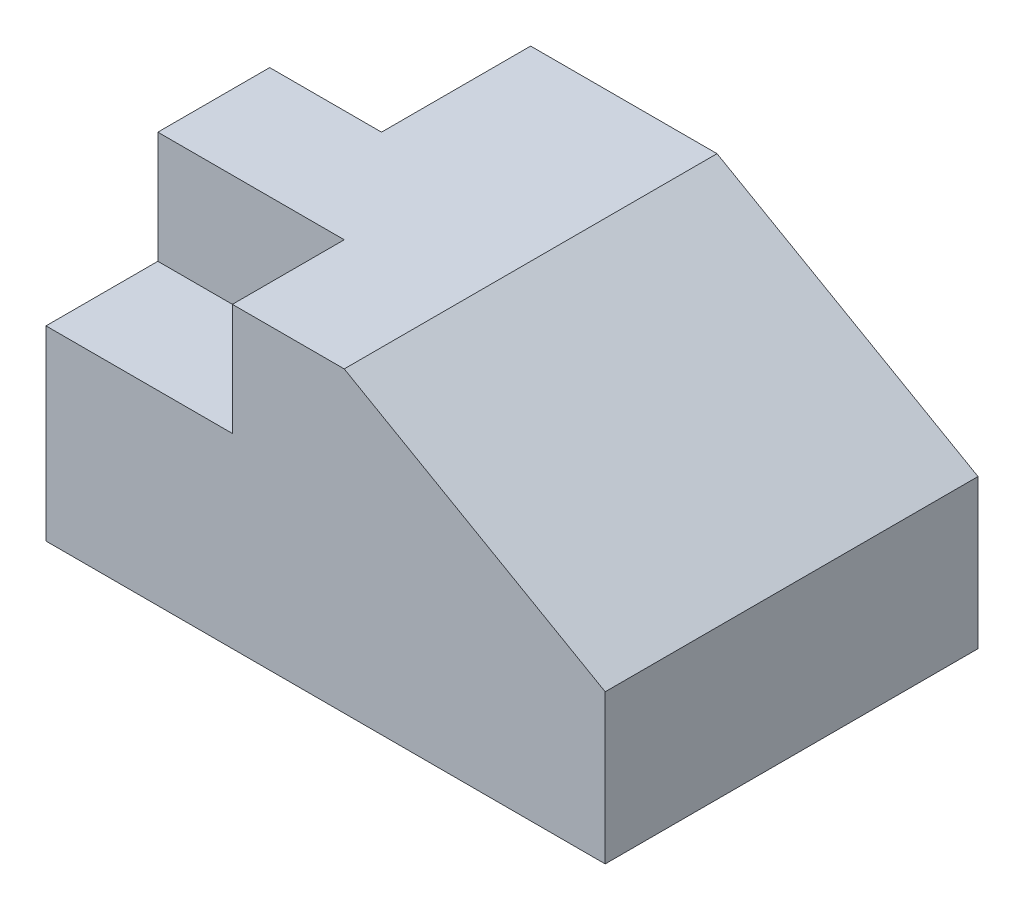
ISO-10303-21;
HEADER;
FILE_DESCRIPTION(('STEP AP214'),'2;1');
FILE_NAME('part.step','',(''),(''),'','','');
FILE_SCHEMA(('AUTOMOTIVE_DESIGN { 1 0 10303 214 1 1 1 1 }'));
ENDSEC;
DATA;
#1=APPLICATION_CONTEXT('core data for automotive mechanical design processes');
#2=APPLICATION_PROTOCOL_DEFINITION('international standard','automotive_design',2000,#1);
#3=PRODUCT_CONTEXT('',#1,'mechanical');
#4=PRODUCT('Part','Part','',(#3));
#5=PRODUCT_RELATED_PRODUCT_CATEGORY('part','',(#4));
#6=PRODUCT_DEFINITION_FORMATION('','',#4);
#7=PRODUCT_DEFINITION_CONTEXT('part definition',#1,'design');
#8=PRODUCT_DEFINITION('design','',#6,#7);
#9=PRODUCT_DEFINITION_SHAPE('','',#8);
#10=(LENGTH_UNIT() NAMED_UNIT(*) SI_UNIT(.MILLI.,.METRE.));
#11=(NAMED_UNIT(*) PLANE_ANGLE_UNIT() SI_UNIT($,.RADIAN.));
#12=(NAMED_UNIT(*) SI_UNIT($,.STERADIAN.) SOLID_ANGLE_UNIT());
#13=UNCERTAINTY_MEASURE_WITH_UNIT(LENGTH_MEASURE(1.E-05),#10,'distance_accuracy_value','');
#14=(GEOMETRIC_REPRESENTATION_CONTEXT(3) GLOBAL_UNCERTAINTY_ASSIGNED_CONTEXT((#13)) GLOBAL_UNIT_ASSIGNED_CONTEXT((#10,
#11,#12)) REPRESENTATION_CONTEXT('',''));
#15=CARTESIAN_POINT('',(0.,0.,0.));
#16=DIRECTION('',(0.,0.,1.));
#17=DIRECTION('',(1.,0.,0.));
#18=AXIS2_PLACEMENT_3D('',#15,#16,#17);
#19=CARTESIAN_POINT('',(0.,0.,50.));
#20=DIRECTION('',(-1.,0.,0.));
#21=DIRECTION('',(0.,0.,1.));
#22=AXIS2_PLACEMENT_3D('',#19,#20,#21);
#23=PLANE('',#22);
#24=DIRECTION('',(0.,1.,0.));
#25=VECTOR('',#24,1.);
#26=CARTESIAN_POINT('',(0.,50.,-10.));
#27=LINE('',#26,#25);
#28=CARTESIAN_POINT('',(0.,50.,-10.));
#29=VERTEX_POINT('',#28);
#30=CARTESIAN_POINT('',(0.,80.,-10.));
#31=VERTEX_POINT('',#30);
#32=EDGE_CURVE('E128',#29,#31,#27,.T.);
#33=ORIENTED_EDGE('',*,*,#32,.F.);
#34=DIRECTION('',(0.,0.,1.));
#35=VECTOR('',#34,1.);
#36=CARTESIAN_POINT('',(0.,50.,-50.));
#37=LINE('',#36,#35);
#38=CARTESIAN_POINT('',(0.,50.,-50.));
#39=VERTEX_POINT('',#38);
#40=EDGE_CURVE('E131',#39,#29,#37,.T.);
#41=ORIENTED_EDGE('',*,*,#40,.F.);
#42=DIRECTION('',(0.,1.,0.));
#43=VECTOR('',#42,1.);
#44=CARTESIAN_POINT('',(0.,0.,-50.));
#45=LINE('',#44,#43);
#46=CARTESIAN_POINT('',(0.,0.,-50.));
#47=VERTEX_POINT('',#46);
#48=EDGE_CURVE('E187',#47,#39,#45,.T.);
#49=ORIENTED_EDGE('',*,*,#48,.F.);
#50=DIRECTION('',(0.,0.,-1.));
#51=VECTOR('',#50,1.);
#52=CARTESIAN_POINT('',(0.,0.,50.));
#53=LINE('',#52,#51);
#54=CARTESIAN_POINT('',(0.,0.,50.));
#55=VERTEX_POINT('',#54);
#56=EDGE_CURVE('E11',#55,#47,#53,.T.);
#57=ORIENTED_EDGE('',*,*,#56,.F.);
#58=DIRECTION('',(0.,1.,0.));
#59=VECTOR('',#58,1.);
#60=CARTESIAN_POINT('',(0.,0.,50.));
#61=LINE('',#60,#59);
#62=CARTESIAN_POINT('',(0.,50.,50.));
#63=VERTEX_POINT('',#62);
#64=EDGE_CURVE('E172',#55,#63,#61,.T.);
#65=ORIENTED_EDGE('',*,*,#64,.T.);
#66=DIRECTION('',(0.,0.,1.));
#67=VECTOR('',#66,1.);
#68=CARTESIAN_POINT('',(0.,50.,50.));
#69=LINE('',#68,#67);
#70=CARTESIAN_POINT('',(0.,50.,20.));
#71=VERTEX_POINT('',#70);
#72=EDGE_CURVE('E55',#71,#63,#69,.T.);
#73=ORIENTED_EDGE('',*,*,#72,.F.);
#74=DIRECTION('',(0.,1.,0.));
#75=VECTOR('',#74,1.);
#76=CARTESIAN_POINT('',(0.,50.,20.));
#77=LINE('',#76,#75);
#78=CARTESIAN_POINT('',(0.,80.,20.));
#79=VERTEX_POINT('',#78);
#80=EDGE_CURVE('E157',#71,#79,#77,.T.);
#81=ORIENTED_EDGE('',*,*,#80,.T.);
#82=DIRECTION('',(0.,0.,-1.));
#83=VECTOR('',#82,1.);
#84=CARTESIAN_POINT('',(0.,80.,50.));
#85=LINE('',#84,#83);
#86=EDGE_CURVE('E145',#79,#31,#85,.T.);
#87=ORIENTED_EDGE('',*,*,#86,.T.);
#88=EDGE_LOOP('',(#33,#41,#49,#57,#65,#73,#81,#87));
#89=FACE_BOUND('',#88,.T.);
#90=ADVANCED_FACE('F41',(#89),#23,.T.);
#91=CARTESIAN_POINT('',(0.,0.,50.));
#92=DIRECTION('',(0.,-1.,0.));
#93=DIRECTION('',(0.,0.,-1.));
#94=AXIS2_PLACEMENT_3D('',#91,#92,#93);
#95=PLANE('',#94);
#96=DIRECTION('',(-1.,0.,0.));
#97=VECTOR('',#96,1.);
#98=CARTESIAN_POINT('',(0.,0.,-50.));
#99=LINE('',#98,#97);
#100=CARTESIAN_POINT('',(150.,0.,-50.));
#101=VERTEX_POINT('',#100);
#102=EDGE_CURVE('E189',#101,#47,#99,.T.);
#103=ORIENTED_EDGE('',*,*,#102,.F.);
#104=DIRECTION('',(0.,0.,-1.));
#105=VECTOR('',#104,1.);
#106=CARTESIAN_POINT('',(150.,0.,50.));
#107=LINE('',#106,#105);
#108=CARTESIAN_POINT('',(150.,0.,50.));
#109=VERTEX_POINT('',#108);
#110=EDGE_CURVE('E48',#109,#101,#107,.T.);
#111=ORIENTED_EDGE('',*,*,#110,.F.);
#112=DIRECTION('',(-1.,0.,0.));
#113=VECTOR('',#112,1.);
#114=CARTESIAN_POINT('',(0.,0.,50.));
#115=LINE('',#114,#113);
#116=EDGE_CURVE('E175',#109,#55,#115,.T.);
#117=ORIENTED_EDGE('',*,*,#116,.T.);
#118=ORIENTED_EDGE('',*,*,#56,.T.);
#119=EDGE_LOOP('',(#103,#111,#117,#118));
#120=FACE_BOUND('',#119,.T.);
#121=ADVANCED_FACE('F211',(#120),#95,.T.);
#122=CARTESIAN_POINT('',(150.,0.,50.));
#123=DIRECTION('',(1.,0.,0.));
#124=DIRECTION('',(0.,0.,-1.));
#125=AXIS2_PLACEMENT_3D('',#122,#123,#124);
#126=PLANE('',#125);
#127=DIRECTION('',(0.,-1.,0.));
#128=VECTOR('',#127,1.);
#129=CARTESIAN_POINT('',(150.,0.,-50.));
#130=LINE('',#129,#128);
#131=CARTESIAN_POINT('',(150.,40.,-50.));
#132=VERTEX_POINT('',#131);
#133=EDGE_CURVE('E192',#132,#101,#130,.T.);
#134=ORIENTED_EDGE('',*,*,#133,.F.);
#135=DIRECTION('',(0.,0.,-1.));
#136=VECTOR('',#135,1.);
#137=CARTESIAN_POINT('',(150.,40.,50.));
#138=LINE('',#137,#136);
#139=CARTESIAN_POINT('',(150.,40.,50.));
#140=VERTEX_POINT('',#139);
#141=EDGE_CURVE('E203',#140,#132,#138,.T.);
#142=ORIENTED_EDGE('',*,*,#141,.F.);
#143=DIRECTION('',(0.,-1.,0.));
#144=VECTOR('',#143,1.);
#145=CARTESIAN_POINT('',(150.,0.,50.));
#146=LINE('',#145,#144);
#147=EDGE_CURVE('E179',#140,#109,#146,.T.);
#148=ORIENTED_EDGE('',*,*,#147,.T.);
#149=ORIENTED_EDGE('',*,*,#110,.T.);
#150=EDGE_LOOP('',(#134,#142,#148,#149));
#151=FACE_BOUND('',#150,.T.);
#152=ADVANCED_FACE('F207',(#151),#126,.T.);
#153=CARTESIAN_POINT('',(54.1538461538461,94.7692307692307,50.));
#154=DIRECTION('',(0.496138938356834,0.868243142124459,0.));
#155=DIRECTION('',(-0.868243142124459,0.496138938356834,0.));
#156=AXIS2_PLACEMENT_3D('',#153,#154,#155);
#157=PLANE('',#156);
#158=DIRECTION('',(0.868243142124459,-0.496138938356834,0.));
#159=VECTOR('',#158,1.);
#160=CARTESIAN_POINT('',(54.1538461538461,94.7692307692307,-50.));
#161=LINE('',#160,#159);
#162=CARTESIAN_POINT('',(80.,80.,-50.));
#163=VERTEX_POINT('',#162);
#164=EDGE_CURVE('E195',#163,#132,#161,.T.);
#165=ORIENTED_EDGE('',*,*,#164,.F.);
#166=DIRECTION('',(0.,0.,-1.));
#167=VECTOR('',#166,1.);
#168=CARTESIAN_POINT('',(80.,80.,50.));
#169=LINE('',#168,#167);
#170=CARTESIAN_POINT('',(80.,80.,50.));
#171=VERTEX_POINT('',#170);
#172=EDGE_CURVE('E200',#171,#163,#169,.T.);
#173=ORIENTED_EDGE('',*,*,#172,.F.);
#174=DIRECTION('',(0.868243142124459,-0.496138938356834,0.));
#175=VECTOR('',#174,1.);
#176=CARTESIAN_POINT('',(54.1538461538461,94.7692307692307,50.));
#177=LINE('',#176,#175);
#178=EDGE_CURVE('E182',#171,#140,#177,.T.);
#179=ORIENTED_EDGE('',*,*,#178,.T.);
#180=ORIENTED_EDGE('',*,*,#141,.T.);
#181=EDGE_LOOP('',(#165,#173,#179,#180));
#182=FACE_BOUND('',#181,.T.);
#183=ADVANCED_FACE('F219',(#182),#157,.T.);
#184=CARTESIAN_POINT('',(0.,80.,50.));
#185=DIRECTION('',(0.,1.,0.));
#186=DIRECTION('',(0.,0.,1.));
#187=AXIS2_PLACEMENT_3D('',#184,#185,#186);
#188=PLANE('',#187);
#189=DIRECTION('',(0.,0.,-1.));
#190=VECTOR('',#189,1.);
#191=CARTESIAN_POINT('',(30.,80.,-50.));
#192=LINE('',#191,#190);
#193=CARTESIAN_POINT('',(30.,80.,-10.));
#194=VERTEX_POINT('',#193);
#195=CARTESIAN_POINT('',(30.,80.,-50.));
#196=VERTEX_POINT('',#195);
#197=EDGE_CURVE('E140',#194,#196,#192,.T.);
#198=ORIENTED_EDGE('',*,*,#197,.F.);
#199=DIRECTION('',(1.,0.,0.));
#200=VECTOR('',#199,1.);
#201=CARTESIAN_POINT('',(0.,80.,-10.));
#202=LINE('',#201,#200);
#203=EDGE_CURVE('E164',#31,#194,#202,.T.);
#204=ORIENTED_EDGE('',*,*,#203,.F.);
#205=ORIENTED_EDGE('',*,*,#86,.F.);
#206=DIRECTION('',(-1.,0.,0.));
#207=VECTOR('',#206,1.);
#208=CARTESIAN_POINT('',(0.,80.,20.));
#209=LINE('',#208,#207);
#210=CARTESIAN_POINT('',(50.,80.,20.));
#211=VERTEX_POINT('',#210);
#212=EDGE_CURVE('E159',#211,#79,#209,.T.);
#213=ORIENTED_EDGE('',*,*,#212,.F.);
#214=DIRECTION('',(0.,0.,-1.));
#215=VECTOR('',#214,1.);
#216=CARTESIAN_POINT('',(50.,80.,50.));
#217=LINE('',#216,#215);
#218=CARTESIAN_POINT('',(50.,80.,50.));
#219=VERTEX_POINT('',#218);
#220=EDGE_CURVE('E161',#219,#211,#217,.T.);
#221=ORIENTED_EDGE('',*,*,#220,.F.);
#222=DIRECTION('',(1.,0.,0.));
#223=VECTOR('',#222,1.);
#224=CARTESIAN_POINT('',(0.,80.,50.));
#225=LINE('',#224,#223);
#226=EDGE_CURVE('E185',#219,#171,#225,.T.);
#227=ORIENTED_EDGE('',*,*,#226,.T.);
#228=ORIENTED_EDGE('',*,*,#172,.T.);
#229=DIRECTION('',(1.,0.,0.));
#230=VECTOR('',#229,1.);
#231=CARTESIAN_POINT('',(0.,80.,-50.));
#232=LINE('',#231,#230);
#233=EDGE_CURVE('E176',#196,#163,#232,.T.);
#234=ORIENTED_EDGE('',*,*,#233,.F.);
#235=EDGE_LOOP('',(#198,#204,#205,#213,#221,#227,#228,#234));
#236=FACE_BOUND('',#235,.T.);
#237=ADVANCED_FACE('F229',(#236),#188,.T.);
#238=CARTESIAN_POINT('',(0.,0.,50.));
#239=DIRECTION('',(0.,0.,1.));
#240=DIRECTION('',(1.,0.,0.));
#241=AXIS2_PLACEMENT_3D('',#238,#239,#240);
#242=PLANE('',#241);
#243=DIRECTION('',(0.,1.,0.));
#244=VECTOR('',#243,1.);
#245=CARTESIAN_POINT('',(50.,50.,50.));
#246=LINE('',#245,#244);
#247=CARTESIAN_POINT('',(50.,50.,50.));
#248=VERTEX_POINT('',#247);
#249=EDGE_CURVE('E152',#248,#219,#246,.T.);
#250=ORIENTED_EDGE('',*,*,#249,.F.);
#251=DIRECTION('',(1.,0.,0.));
#252=VECTOR('',#251,1.);
#253=CARTESIAN_POINT('',(0.,50.,50.));
#254=LINE('',#253,#252);
#255=EDGE_CURVE('E169',#63,#248,#254,.T.);
#256=ORIENTED_EDGE('',*,*,#255,.F.);
#257=ORIENTED_EDGE('',*,*,#64,.F.);
#258=ORIENTED_EDGE('',*,*,#116,.F.);
#259=ORIENTED_EDGE('',*,*,#147,.F.);
#260=ORIENTED_EDGE('',*,*,#178,.F.);
#261=ORIENTED_EDGE('',*,*,#226,.F.);
#262=EDGE_LOOP('',(#250,#256,#257,#258,#259,#260,#261));
#263=FACE_BOUND('',#262,.T.);
#264=ADVANCED_FACE('F223',(#263),#242,.T.);
#265=CARTESIAN_POINT('',(0.,0.,-50.));
#266=DIRECTION('',(0.,0.,1.));
#267=DIRECTION('',(1.,0.,0.));
#268=AXIS2_PLACEMENT_3D('',#265,#266,#267);
#269=PLANE('',#268);
#270=DIRECTION('',(-1.,0.,0.));
#271=VECTOR('',#270,1.);
#272=CARTESIAN_POINT('',(0.,50.,-50.));
#273=LINE('',#272,#271);
#274=CARTESIAN_POINT('',(30.,50.,-50.));
#275=VERTEX_POINT('',#274);
#276=EDGE_CURVE('E136',#275,#39,#273,.T.);
#277=ORIENTED_EDGE('',*,*,#276,.F.);
#278=DIRECTION('',(0.,1.,0.));
#279=VECTOR('',#278,1.);
#280=CARTESIAN_POINT('',(30.,50.,-50.));
#281=LINE('',#280,#279);
#282=EDGE_CURVE('E147',#275,#196,#281,.T.);
#283=ORIENTED_EDGE('',*,*,#282,.T.);
#284=ORIENTED_EDGE('',*,*,#233,.T.);
#285=ORIENTED_EDGE('',*,*,#164,.T.);
#286=ORIENTED_EDGE('',*,*,#133,.T.);
#287=ORIENTED_EDGE('',*,*,#102,.T.);
#288=ORIENTED_EDGE('',*,*,#48,.T.);
#289=EDGE_LOOP('',(#277,#283,#284,#285,#286,#287,#288));
#290=FACE_BOUND('',#289,.T.);
#291=ADVANCED_FACE('F213',(#290),#269,.F.);
#292=CARTESIAN_POINT('',(30.,50.,-50.));
#293=DIRECTION('',(1.,0.,0.));
#294=DIRECTION('',(0.,0.,-1.));
#295=AXIS2_PLACEMENT_3D('',#292,#293,#294);
#296=PLANE('',#295);
#297=ORIENTED_EDGE('',*,*,#197,.T.);
#298=ORIENTED_EDGE('',*,*,#282,.F.);
#299=DIRECTION('',(0.,0.,-1.));
#300=VECTOR('',#299,1.);
#301=CARTESIAN_POINT('',(30.,50.,-50.));
#302=LINE('',#301,#300);
#303=CARTESIAN_POINT('',(30.,50.,-10.));
#304=VERTEX_POINT('',#303);
#305=EDGE_CURVE('E63',#304,#275,#302,.T.);
#306=ORIENTED_EDGE('',*,*,#305,.F.);
#307=DIRECTION('',(0.,1.,0.));
#308=VECTOR('',#307,1.);
#309=CARTESIAN_POINT('',(30.,50.,-10.));
#310=LINE('',#309,#308);
#311=EDGE_CURVE('E130',#304,#194,#310,.T.);
#312=ORIENTED_EDGE('',*,*,#311,.T.);
#313=EDGE_LOOP('',(#297,#298,#306,#312));
#314=FACE_BOUND('',#313,.T.);
#315=ADVANCED_FACE('F259',(#314),#296,.F.);
#316=CARTESIAN_POINT('',(0.,50.,-10.));
#317=DIRECTION('',(0.,0.,1.));
#318=DIRECTION('',(1.,0.,0.));
#319=AXIS2_PLACEMENT_3D('',#316,#317,#318);
#320=PLANE('',#319);
#321=ORIENTED_EDGE('',*,*,#203,.T.);
#322=ORIENTED_EDGE('',*,*,#311,.F.);
#323=DIRECTION('',(1.,0.,0.));
#324=VECTOR('',#323,1.);
#325=CARTESIAN_POINT('',(0.,50.,-10.));
#326=LINE('',#325,#324);
#327=EDGE_CURVE('E123',#29,#304,#326,.T.);
#328=ORIENTED_EDGE('',*,*,#327,.F.);
#329=ORIENTED_EDGE('',*,*,#32,.T.);
#330=EDGE_LOOP('',(#321,#322,#328,#329));
#331=FACE_BOUND('',#330,.T.);
#332=ADVANCED_FACE('F126',(#331),#320,.F.);
#333=CARTESIAN_POINT('',(0.,50.,0.));
#334=DIRECTION('',(0.,1.,0.));
#335=DIRECTION('',(0.,0.,1.));
#336=AXIS2_PLACEMENT_3D('',#333,#334,#335);
#337=PLANE('',#336);
#338=ORIENTED_EDGE('',*,*,#40,.T.);
#339=ORIENTED_EDGE('',*,*,#327,.T.);
#340=ORIENTED_EDGE('',*,*,#305,.T.);
#341=ORIENTED_EDGE('',*,*,#276,.T.);
#342=EDGE_LOOP('',(#338,#339,#340,#341));
#343=FACE_BOUND('',#342,.T.);
#344=ADVANCED_FACE('F134',(#343),#337,.T.);
#345=CARTESIAN_POINT('',(0.,50.,20.));
#346=DIRECTION('',(0.,0.,-1.));
#347=DIRECTION('',(-1.,0.,0.));
#348=AXIS2_PLACEMENT_3D('',#345,#346,#347);
#349=PLANE('',#348);
#350=ORIENTED_EDGE('',*,*,#212,.T.);
#351=ORIENTED_EDGE('',*,*,#80,.F.);
#352=DIRECTION('',(-1.,0.,0.));
#353=VECTOR('',#352,1.);
#354=CARTESIAN_POINT('',(0.,50.,20.));
#355=LINE('',#354,#353);
#356=CARTESIAN_POINT('',(50.,50.,20.));
#357=VERTEX_POINT('',#356);
#358=EDGE_CURVE('E154',#357,#71,#355,.T.);
#359=ORIENTED_EDGE('',*,*,#358,.F.);
#360=DIRECTION('',(0.,1.,0.));
#361=VECTOR('',#360,1.);
#362=CARTESIAN_POINT('',(50.,50.,20.));
#363=LINE('',#362,#361);
#364=EDGE_CURVE('E155',#357,#211,#363,.T.);
#365=ORIENTED_EDGE('',*,*,#364,.T.);
#366=EDGE_LOOP('',(#350,#351,#359,#365));
#367=FACE_BOUND('',#366,.T.);
#368=ADVANCED_FACE('F241',(#367),#349,.F.);
#369=CARTESIAN_POINT('',(50.,50.,50.));
#370=DIRECTION('',(1.,0.,0.));
#371=DIRECTION('',(0.,0.,-1.));
#372=AXIS2_PLACEMENT_3D('',#369,#370,#371);
#373=PLANE('',#372);
#374=ORIENTED_EDGE('',*,*,#220,.T.);
#375=ORIENTED_EDGE('',*,*,#364,.F.);
#376=DIRECTION('',(0.,0.,-1.));
#377=VECTOR('',#376,1.);
#378=CARTESIAN_POINT('',(50.,50.,50.));
#379=LINE('',#378,#377);
#380=EDGE_CURVE('E166',#248,#357,#379,.T.);
#381=ORIENTED_EDGE('',*,*,#380,.F.);
#382=ORIENTED_EDGE('',*,*,#249,.T.);
#383=EDGE_LOOP('',(#374,#375,#381,#382));
#384=FACE_BOUND('',#383,.T.);
#385=ADVANCED_FACE('F233',(#384),#373,.F.);
#386=CARTESIAN_POINT('',(0.,50.,0.));
#387=DIRECTION('',(0.,-1.,0.));
#388=DIRECTION('',(0.,0.,-1.));
#389=AXIS2_PLACEMENT_3D('',#386,#387,#388);
#390=PLANE('',#389);
#391=ORIENTED_EDGE('',*,*,#72,.T.);
#392=ORIENTED_EDGE('',*,*,#255,.T.);
#393=ORIENTED_EDGE('',*,*,#380,.T.);
#394=ORIENTED_EDGE('',*,*,#358,.T.);
#395=EDGE_LOOP('',(#391,#392,#393,#394));
#396=FACE_BOUND('',#395,.T.);
#397=ADVANCED_FACE('F235',(#396),#390,.F.);
#398=CLOSED_SHELL('',(#90,#121,#152,#183,#237,#264,#291,#315,#332,#344,#368,#385,#397));
#399=MANIFOLD_SOLID_BREP('B2',#398);
#400=ADVANCED_BREP_SHAPE_REPRESENTATION('',(#18,#399),#14);
#401=SHAPE_DEFINITION_REPRESENTATION(#9,#400);
ENDSEC;
END-ISO-10303-21;
